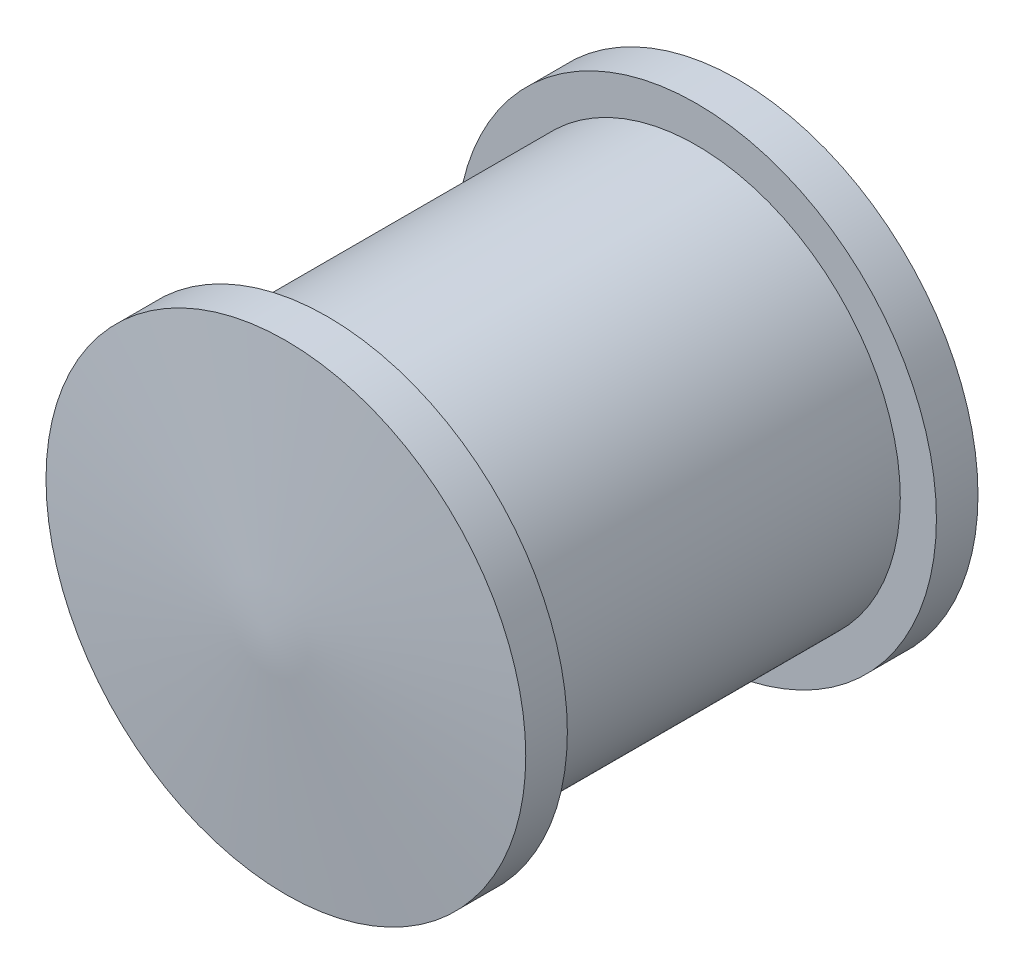
ISO-10303-21;
HEADER;
FILE_DESCRIPTION(('STEP AP214'),'2;1');
FILE_NAME('part.step','',(''),(''),'','','');
FILE_SCHEMA(('AUTOMOTIVE_DESIGN { 1 0 10303 214 1 1 1 1 }'));
ENDSEC;
DATA;
#1=APPLICATION_CONTEXT('core data for automotive mechanical design processes');
#2=APPLICATION_PROTOCOL_DEFINITION('international standard','automotive_design',2000,#1);
#3=PRODUCT_CONTEXT('',#1,'mechanical');
#4=PRODUCT('Part','Part','',(#3));
#5=PRODUCT_RELATED_PRODUCT_CATEGORY('part','',(#4));
#6=PRODUCT_DEFINITION_FORMATION('','',#4);
#7=PRODUCT_DEFINITION_CONTEXT('part definition',#1,'design');
#8=PRODUCT_DEFINITION('design','',#6,#7);
#9=PRODUCT_DEFINITION_SHAPE('','',#8);
#10=(LENGTH_UNIT() NAMED_UNIT(*) SI_UNIT(.MILLI.,.METRE.));
#11=(NAMED_UNIT(*) PLANE_ANGLE_UNIT() SI_UNIT($,.RADIAN.));
#12=(NAMED_UNIT(*) SI_UNIT($,.STERADIAN.) SOLID_ANGLE_UNIT());
#13=UNCERTAINTY_MEASURE_WITH_UNIT(LENGTH_MEASURE(1.E-05),#10,'distance_accuracy_value','');
#14=(GEOMETRIC_REPRESENTATION_CONTEXT(3) GLOBAL_UNCERTAINTY_ASSIGNED_CONTEXT((#13)) GLOBAL_UNIT_ASSIGNED_CONTEXT((#10,
#11,#12)) REPRESENTATION_CONTEXT('',''));
#15=CARTESIAN_POINT('',(0.,0.,0.));
#16=DIRECTION('',(0.,0.,1.));
#17=DIRECTION('',(1.,0.,0.));
#18=AXIS2_PLACEMENT_3D('',#15,#16,#17);
#19=CARTESIAN_POINT('',(0.,0.,0.));
#20=DIRECTION('',(0.,0.,-1.));
#21=DIRECTION('',(-1.,0.,0.));
#22=AXIS2_PLACEMENT_3D('',#19,#20,#21);
#23=CONICAL_SURFACE('',#22,0.,1.48352986419518);
#24=CARTESIAN_POINT('',(0.,0.,-1.30795551971257));
#25=DIRECTION('',(0.,0.,1.));
#26=DIRECTION('',(1.,0.,0.));
#27=AXIS2_PLACEMENT_3D('',#24,#25,#26);
#28=CIRCLE('',#27,14.95);
#29=CARTESIAN_POINT('',(14.95,0.,-1.30795551971257));
#30=VERTEX_POINT('',#29);
#31=EDGE_CURVE('E11',#30,#30,#28,.T.);
#32=ORIENTED_EDGE('',*,*,#31,.T.);
#33=EDGE_LOOP('',(#32));
#34=FACE_BOUND('',#33,.T.);
#35=CARTESIAN_POINT('',(0.,0.,0.));
#36=VERTEX_POINT('',#35);
#37=VERTEX_LOOP('',#36);
#38=FACE_BOUND('',#37,.T.);
#39=ADVANCED_FACE('F41',(#34,#38),#23,.T.);
#40=CARTESIAN_POINT('',(0.,0.,0.));
#41=DIRECTION('',(0.,0.,1.));
#42=DIRECTION('',(1.,0.,0.));
#43=AXIS2_PLACEMENT_3D('',#40,#41,#42);
#44=CYLINDRICAL_SURFACE('',#43,14.95);
#45=CARTESIAN_POINT('',(0.,0.,-3.9));
#46=DIRECTION('',(0.,0.,1.));
#47=DIRECTION('',(1.,0.,0.));
#48=AXIS2_PLACEMENT_3D('',#45,#46,#47);
#49=CIRCLE('',#48,14.95);
#50=CARTESIAN_POINT('',(14.95,0.,-3.9));
#51=VERTEX_POINT('',#50);
#52=EDGE_CURVE('E48',#51,#51,#49,.T.);
#53=ORIENTED_EDGE('',*,*,#52,.T.);
#54=EDGE_LOOP('',(#53));
#55=FACE_BOUND('',#54,.T.);
#56=ORIENTED_EDGE('',*,*,#31,.F.);
#57=EDGE_LOOP('',(#56));
#58=FACE_BOUND('',#57,.T.);
#59=ADVANCED_FACE('F76',(#55,#58),#44,.T.);
#60=CARTESIAN_POINT('',(14.95,0.,-3.9));
#61=DIRECTION('',(0.,0.,-1.));
#62=DIRECTION('',(-1.,0.,0.));
#63=AXIS2_PLACEMENT_3D('',#60,#61,#62);
#64=PLANE('',#63);
#65=CARTESIAN_POINT('',(0.,0.,-3.9));
#66=DIRECTION('',(0.,0.,1.));
#67=DIRECTION('',(1.,0.,0.));
#68=AXIS2_PLACEMENT_3D('',#65,#66,#67);
#69=CIRCLE('',#68,12.7);
#70=CARTESIAN_POINT('',(12.7,0.,-3.9));
#71=VERTEX_POINT('',#70);
#72=EDGE_CURVE('E71',#71,#71,#69,.T.);
#73=ORIENTED_EDGE('',*,*,#72,.T.);
#74=EDGE_LOOP('',(#73));
#75=FACE_BOUND('',#74,.T.);
#76=ORIENTED_EDGE('',*,*,#52,.F.);
#77=EDGE_LOOP('',(#76));
#78=FACE_BOUND('',#77,.T.);
#79=ADVANCED_FACE('F79',(#75,#78),#64,.T.);
#80=CARTESIAN_POINT('',(0.,0.,0.));
#81=DIRECTION('',(0.,0.,1.));
#82=DIRECTION('',(1.,0.,0.));
#83=AXIS2_PLACEMENT_3D('',#80,#81,#82);
#84=CYLINDRICAL_SURFACE('',#83,12.7);
#85=CARTESIAN_POINT('',(0.,0.,-26.9));
#86=DIRECTION('',(0.,0.,1.));
#87=DIRECTION('',(1.,0.,0.));
#88=AXIS2_PLACEMENT_3D('',#85,#86,#87);
#89=CIRCLE('',#88,12.7);
#90=CARTESIAN_POINT('',(12.7,0.,-26.9));
#91=VERTEX_POINT('',#90);
#92=EDGE_CURVE('E66',#91,#91,#89,.T.);
#93=ORIENTED_EDGE('',*,*,#92,.T.);
#94=EDGE_LOOP('',(#93));
#95=FACE_BOUND('',#94,.T.);
#96=ORIENTED_EDGE('',*,*,#72,.F.);
#97=EDGE_LOOP('',(#96));
#98=FACE_BOUND('',#97,.T.);
#99=ADVANCED_FACE('F81',(#95,#98),#84,.T.);
#100=CARTESIAN_POINT('',(12.7,0.,-26.9));
#101=DIRECTION('',(0.,0.,1.));
#102=DIRECTION('',(1.,0.,0.));
#103=AXIS2_PLACEMENT_3D('',#100,#101,#102);
#104=PLANE('',#103);
#105=CARTESIAN_POINT('',(0.,0.,-26.9));
#106=DIRECTION('',(0.,0.,1.));
#107=DIRECTION('',(1.,0.,0.));
#108=AXIS2_PLACEMENT_3D('',#105,#106,#107);
#109=CIRCLE('',#108,14.95);
#110=CARTESIAN_POINT('',(14.95,0.,-26.9));
#111=VERTEX_POINT('',#110);
#112=EDGE_CURVE('E63',#111,#111,#109,.T.);
#113=ORIENTED_EDGE('',*,*,#112,.T.);
#114=EDGE_LOOP('',(#113));
#115=FACE_BOUND('',#114,.T.);
#116=ORIENTED_EDGE('',*,*,#92,.F.);
#117=EDGE_LOOP('',(#116));
#118=FACE_BOUND('',#117,.T.);
#119=ADVANCED_FACE('F88',(#115,#118),#104,.T.);
#120=CARTESIAN_POINT('',(0.,0.,0.));
#121=DIRECTION('',(0.,0.,1.));
#122=DIRECTION('',(1.,0.,0.));
#123=AXIS2_PLACEMENT_3D('',#120,#121,#122);
#124=CYLINDRICAL_SURFACE('',#123,14.95);
#125=CARTESIAN_POINT('',(0.,0.,-29.4920444802875));
#126=DIRECTION('',(0.,0.,1.));
#127=DIRECTION('',(1.,0.,0.));
#128=AXIS2_PLACEMENT_3D('',#125,#126,#127);
#129=CIRCLE('',#128,14.95);
#130=CARTESIAN_POINT('',(14.95,0.,-29.4920444802875));
#131=VERTEX_POINT('',#130);
#132=EDGE_CURVE('E61',#131,#131,#129,.T.);
#133=ORIENTED_EDGE('',*,*,#132,.T.);
#134=EDGE_LOOP('',(#133));
#135=FACE_BOUND('',#134,.T.);
#136=ORIENTED_EDGE('',*,*,#112,.F.);
#137=EDGE_LOOP('',(#136));
#138=FACE_BOUND('',#137,.T.);
#139=ADVANCED_FACE('F57',(#135,#138),#124,.T.);
#140=CARTESIAN_POINT('',(0.,0.,-29.4920444802875));
#141=DIRECTION('',(0.,0.,1.));
#142=DIRECTION('',(1.,0.,0.));
#143=AXIS2_PLACEMENT_3D('',#140,#141,#142);
#144=CONICAL_SURFACE('',#143,14.95,1.48352986419519);
#145=CARTESIAN_POINT('',(0.,0.,-30.8));
#146=VERTEX_POINT('',#145);
#147=VERTEX_LOOP('',#146);
#148=FACE_BOUND('',#147,.T.);
#149=ORIENTED_EDGE('',*,*,#132,.F.);
#150=EDGE_LOOP('',(#149));
#151=FACE_BOUND('',#150,.T.);
#152=ADVANCED_FACE('F54',(#148,#151),#144,.T.);
#153=CLOSED_SHELL('',(#39,#59,#79,#99,#119,#139,#152));
#154=MANIFOLD_SOLID_BREP('B2',#153);
#155=ADVANCED_BREP_SHAPE_REPRESENTATION('',(#18,#154),#14);
#156=SHAPE_DEFINITION_REPRESENTATION(#9,#155);
ENDSEC;
END-ISO-10303-21;
